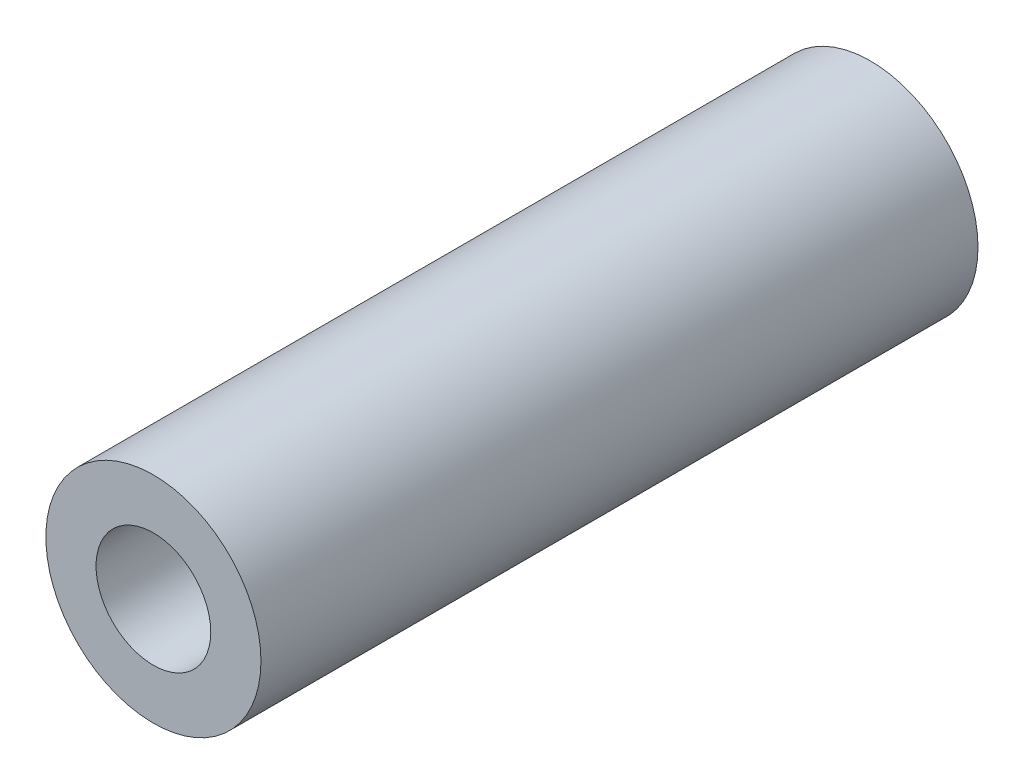
ISO-10303-21;
HEADER;
FILE_DESCRIPTION(('STEP AP214'),'2;1');
FILE_NAME('part.step','',(''),(''),'','','');
FILE_SCHEMA(('AUTOMOTIVE_DESIGN { 1 0 10303 214 1 1 1 1 }'));
ENDSEC;
DATA;
#1=APPLICATION_CONTEXT('core data for automotive mechanical design processes');
#2=APPLICATION_PROTOCOL_DEFINITION('international standard','automotive_design',2000,#1);
#3=PRODUCT_CONTEXT('',#1,'mechanical');
#4=PRODUCT('Part','Part','',(#3));
#5=PRODUCT_RELATED_PRODUCT_CATEGORY('part','',(#4));
#6=PRODUCT_DEFINITION_FORMATION('','',#4);
#7=PRODUCT_DEFINITION_CONTEXT('part definition',#1,'design');
#8=PRODUCT_DEFINITION('design','',#6,#7);
#9=PRODUCT_DEFINITION_SHAPE('','',#8);
#10=(LENGTH_UNIT() NAMED_UNIT(*) SI_UNIT(.MILLI.,.METRE.));
#11=(NAMED_UNIT(*) PLANE_ANGLE_UNIT() SI_UNIT($,.RADIAN.));
#12=(NAMED_UNIT(*) SI_UNIT($,.STERADIAN.) SOLID_ANGLE_UNIT());
#13=UNCERTAINTY_MEASURE_WITH_UNIT(LENGTH_MEASURE(1.E-05),#10,'distance_accuracy_value','');
#14=(GEOMETRIC_REPRESENTATION_CONTEXT(3) GLOBAL_UNCERTAINTY_ASSIGNED_CONTEXT((#13)) GLOBAL_UNIT_ASSIGNED_CONTEXT((#10,
#11,#12)) REPRESENTATION_CONTEXT('',''));
#15=CARTESIAN_POINT('',(0.,0.,0.));
#16=DIRECTION('',(0.,0.,1.));
#17=DIRECTION('',(1.,0.,0.));
#18=AXIS2_PLACEMENT_3D('',#15,#16,#17);
#19=CARTESIAN_POINT('',(0.,0.,50.));
#20=DIRECTION('',(0.,0.,-1.));
#21=DIRECTION('',(-1.,0.,0.));
#22=AXIS2_PLACEMENT_3D('',#19,#20,#21);
#23=CYLINDRICAL_SURFACE('',#22,7.5);
#24=CARTESIAN_POINT('',(0.,0.,50.));
#25=DIRECTION('',(0.,0.,1.));
#26=DIRECTION('',(1.,0.,0.));
#27=AXIS2_PLACEMENT_3D('',#24,#25,#26);
#28=CIRCLE('',#27,7.5);
#29=CARTESIAN_POINT('',(7.5,0.,50.));
#30=VERTEX_POINT('',#29);
#31=EDGE_CURVE('E10',#30,#30,#28,.T.);
#32=ORIENTED_EDGE('',*,*,#31,.F.);
#33=EDGE_LOOP('',(#32));
#34=FACE_BOUND('',#33,.T.);
#35=CARTESIAN_POINT('',(0.,0.,0.));
#36=DIRECTION('',(0.,0.,1.));
#37=DIRECTION('',(1.,0.,0.));
#38=AXIS2_PLACEMENT_3D('',#35,#36,#37);
#39=CIRCLE('',#38,7.5);
#40=CARTESIAN_POINT('',(7.5,0.,0.));
#41=VERTEX_POINT('',#40);
#42=EDGE_CURVE('E40',#41,#41,#39,.T.);
#43=ORIENTED_EDGE('',*,*,#42,.T.);
#44=EDGE_LOOP('',(#43));
#45=FACE_BOUND('',#44,.T.);
#46=ADVANCED_FACE('F37',(#34,#45),#23,.T.);
#47=CARTESIAN_POINT('',(0.,0.,50.));
#48=DIRECTION('',(0.,0.,1.));
#49=DIRECTION('',(1.,0.,0.));
#50=AXIS2_PLACEMENT_3D('',#47,#48,#49);
#51=PLANE('',#50);
#52=CARTESIAN_POINT('',(0.,0.,50.));
#53=DIRECTION('',(0.,0.,1.));
#54=DIRECTION('',(1.,0.,0.));
#55=AXIS2_PLACEMENT_3D('',#52,#53,#54);
#56=CIRCLE('',#55,4.);
#57=CARTESIAN_POINT('',(4.,0.,50.));
#58=VERTEX_POINT('',#57);
#59=EDGE_CURVE('E51',#58,#58,#56,.T.);
#60=ORIENTED_EDGE('',*,*,#59,.F.);
#61=EDGE_LOOP('',(#60));
#62=FACE_BOUND('',#61,.T.);
#63=ORIENTED_EDGE('',*,*,#31,.T.);
#64=EDGE_LOOP('',(#63));
#65=FACE_BOUND('',#64,.T.);
#66=ADVANCED_FACE('F68',(#62,#65),#51,.T.);
#67=CARTESIAN_POINT('',(0.,0.,0.));
#68=DIRECTION('',(0.,0.,1.));
#69=DIRECTION('',(1.,0.,0.));
#70=AXIS2_PLACEMENT_3D('',#67,#68,#69);
#71=PLANE('',#70);
#72=ORIENTED_EDGE('',*,*,#42,.F.);
#73=EDGE_LOOP('',(#72));
#74=FACE_BOUND('',#73,.T.);
#75=ADVANCED_FACE('F64',(#74),#71,.F.);
#76=CARTESIAN_POINT('',(0.,0.,20.));
#77=DIRECTION('',(0.,0.,1.));
#78=DIRECTION('',(1.,0.,0.));
#79=AXIS2_PLACEMENT_3D('',#76,#77,#78);
#80=CYLINDRICAL_SURFACE('',#79,4.);
#81=CARTESIAN_POINT('',(0.,0.,20.));
#82=DIRECTION('',(0.,0.,1.));
#83=DIRECTION('',(1.,0.,0.));
#84=AXIS2_PLACEMENT_3D('',#81,#82,#83);
#85=CIRCLE('',#84,4.);
#86=CARTESIAN_POINT('',(4.,0.,20.));
#87=VERTEX_POINT('',#86);
#88=EDGE_CURVE('E49',#87,#87,#85,.T.);
#89=ORIENTED_EDGE('',*,*,#88,.F.);
#90=EDGE_LOOP('',(#89));
#91=FACE_BOUND('',#90,.T.);
#92=ORIENTED_EDGE('',*,*,#59,.T.);
#93=EDGE_LOOP('',(#92));
#94=FACE_BOUND('',#93,.T.);
#95=ADVANCED_FACE('F61',(#91,#94),#80,.F.);
#96=CARTESIAN_POINT('',(0.,0.,20.));
#97=DIRECTION('',(0.,0.,1.));
#98=DIRECTION('',(1.,0.,0.));
#99=AXIS2_PLACEMENT_3D('',#96,#97,#98);
#100=PLANE('',#99);
#101=ORIENTED_EDGE('',*,*,#88,.T.);
#102=EDGE_LOOP('',(#101));
#103=FACE_BOUND('',#102,.T.);
#104=ADVANCED_FACE('F59',(#103),#100,.T.);
#105=CLOSED_SHELL('',(#46,#66,#75,#95,#104));
#106=MANIFOLD_SOLID_BREP('B2',#105);
#107=ADVANCED_BREP_SHAPE_REPRESENTATION('',(#18,#106),#14);
#108=SHAPE_DEFINITION_REPRESENTATION(#9,#107);
ENDSEC;
END-ISO-10303-21;
